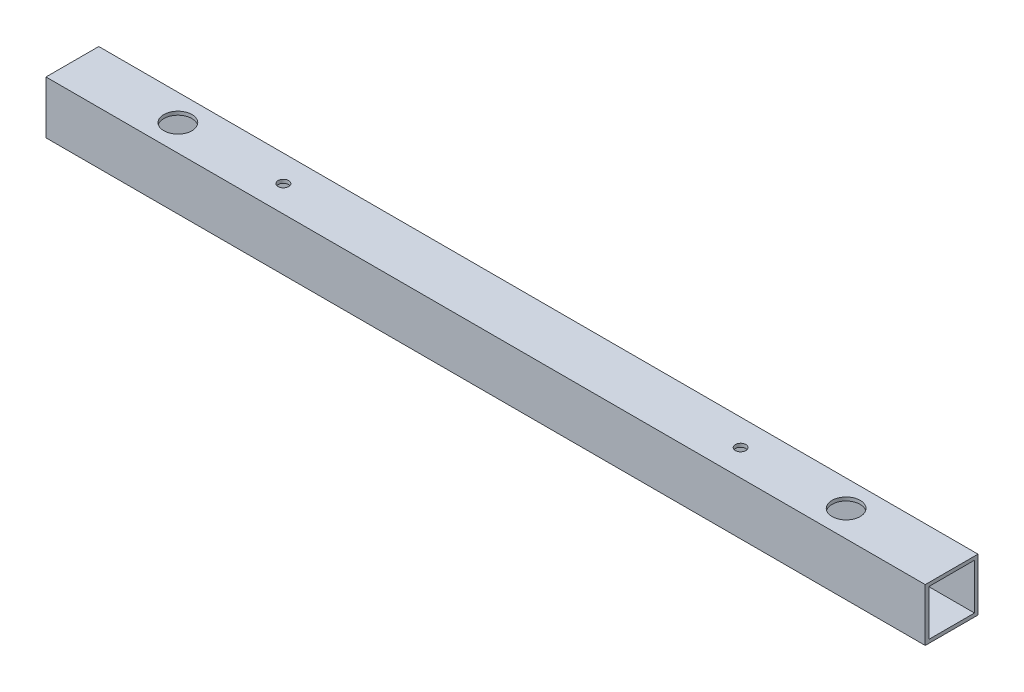
ISO-10303-21;
HEADER;
FILE_DESCRIPTION(('STEP AP214'),'2;1');
FILE_NAME('part.step','',(''),(''),'','','');
FILE_SCHEMA(('AUTOMOTIVE_DESIGN { 1 0 10303 214 1 1 1 1 }'));
ENDSEC;
DATA;
#1=APPLICATION_CONTEXT('core data for automotive mechanical design processes');
#2=APPLICATION_PROTOCOL_DEFINITION('international standard','automotive_design',2000,#1);
#3=PRODUCT_CONTEXT('',#1,'mechanical');
#4=PRODUCT('Part','Part','',(#3));
#5=PRODUCT_RELATED_PRODUCT_CATEGORY('part','',(#4));
#6=PRODUCT_DEFINITION_FORMATION('','',#4);
#7=PRODUCT_DEFINITION_CONTEXT('part definition',#1,'design');
#8=PRODUCT_DEFINITION('design','',#6,#7);
#9=PRODUCT_DEFINITION_SHAPE('','',#8);
#10=(LENGTH_UNIT() NAMED_UNIT(*) SI_UNIT(.MILLI.,.METRE.));
#11=(NAMED_UNIT(*) PLANE_ANGLE_UNIT() SI_UNIT($,.RADIAN.));
#12=(NAMED_UNIT(*) SI_UNIT($,.STERADIAN.) SOLID_ANGLE_UNIT());
#13=UNCERTAINTY_MEASURE_WITH_UNIT(LENGTH_MEASURE(1.E-05),#10,'distance_accuracy_value','');
#14=(GEOMETRIC_REPRESENTATION_CONTEXT(3) GLOBAL_UNCERTAINTY_ASSIGNED_CONTEXT((#13)) GLOBAL_UNIT_ASSIGNED_CONTEXT((#10,
#11,#12)) REPRESENTATION_CONTEXT('',''));
#15=CARTESIAN_POINT('',(0.,0.,0.));
#16=DIRECTION('',(0.,0.,1.));
#17=DIRECTION('',(1.,0.,0.));
#18=AXIS2_PLACEMENT_3D('',#15,#16,#17);
#19=CARTESIAN_POINT('',(250.,0.,0.));
#20=DIRECTION('',(-1.,0.,0.));
#21=DIRECTION('',(0.,0.,1.));
#22=AXIS2_PLACEMENT_3D('',#19,#20,#21);
#23=PLANE('',#22);
#24=DIRECTION('',(0.,1.,0.));
#25=VECTOR('',#24,1.);
#26=CARTESIAN_POINT('',(250.,-7.5,-7.5));
#27=LINE('',#26,#25);
#28=CARTESIAN_POINT('',(250.,-7.5,-7.5));
#29=VERTEX_POINT('',#28);
#30=CARTESIAN_POINT('',(250.,7.5,-7.5));
#31=VERTEX_POINT('',#30);
#32=EDGE_CURVE('E139',#29,#31,#27,.T.);
#33=ORIENTED_EDGE('',*,*,#32,.T.);
#34=DIRECTION('',(0.,0.,1.));
#35=VECTOR('',#34,1.);
#36=CARTESIAN_POINT('',(250.,7.5,7.5));
#37=LINE('',#36,#35);
#38=CARTESIAN_POINT('',(250.,7.5,7.5));
#39=VERTEX_POINT('',#38);
#40=EDGE_CURVE('E142',#31,#39,#37,.T.);
#41=ORIENTED_EDGE('',*,*,#40,.T.);
#42=DIRECTION('',(0.,-1.,0.));
#43=VECTOR('',#42,1.);
#44=CARTESIAN_POINT('',(250.,-7.5,7.5));
#45=LINE('',#44,#43);
#46=CARTESIAN_POINT('',(250.,-7.5,7.5));
#47=VERTEX_POINT('',#46);
#48=EDGE_CURVE('E145',#39,#47,#45,.T.);
#49=ORIENTED_EDGE('',*,*,#48,.T.);
#50=DIRECTION('',(0.,0.,-1.));
#51=VECTOR('',#50,1.);
#52=CARTESIAN_POINT('',(250.,-7.5,7.5));
#53=LINE('',#52,#51);
#54=EDGE_CURVE('E147',#47,#29,#53,.T.);
#55=ORIENTED_EDGE('',*,*,#54,.T.);
#56=EDGE_LOOP('',(#33,#41,#49,#55));
#57=FACE_BOUND('',#56,.T.);
#58=DIRECTION('',(0.,-1.,0.));
#59=VECTOR('',#58,1.);
#60=CARTESIAN_POINT('',(250.,-6.5,6.5));
#61=LINE('',#60,#59);
#62=CARTESIAN_POINT('',(250.,6.5,6.5));
#63=VERTEX_POINT('',#62);
#64=CARTESIAN_POINT('',(250.,-6.5,6.5));
#65=VERTEX_POINT('',#64);
#66=EDGE_CURVE('E101',#63,#65,#61,.T.);
#67=ORIENTED_EDGE('',*,*,#66,.F.);
#68=DIRECTION('',(0.,0.,1.));
#69=VECTOR('',#68,1.);
#70=CARTESIAN_POINT('',(250.,6.5,6.5));
#71=LINE('',#70,#69);
#72=CARTESIAN_POINT('',(250.,6.5,-6.5));
#73=VERTEX_POINT('',#72);
#74=EDGE_CURVE('E123',#73,#63,#71,.T.);
#75=ORIENTED_EDGE('',*,*,#74,.F.);
#76=DIRECTION('',(0.,1.,0.));
#77=VECTOR('',#76,1.);
#78=CARTESIAN_POINT('',(250.,-6.5,-6.5));
#79=LINE('',#78,#77);
#80=CARTESIAN_POINT('',(250.,-6.5,-6.5));
#81=VERTEX_POINT('',#80);
#82=EDGE_CURVE('E121',#81,#73,#79,.T.);
#83=ORIENTED_EDGE('',*,*,#82,.F.);
#84=DIRECTION('',(0.,0.,-1.));
#85=VECTOR('',#84,1.);
#86=CARTESIAN_POINT('',(250.,-6.5,6.5));
#87=LINE('',#86,#85);
#88=EDGE_CURVE('E109',#65,#81,#87,.T.);
#89=ORIENTED_EDGE('',*,*,#88,.F.);
#90=EDGE_LOOP('',(#67,#75,#83,#89));
#91=FACE_BOUND('',#90,.T.);
#92=ADVANCED_FACE('F34',(#57,#91),#23,.F.);
#93=CARTESIAN_POINT('',(0.,0.,0.));
#94=DIRECTION('',(-1.,0.,0.));
#95=DIRECTION('',(0.,0.,1.));
#96=AXIS2_PLACEMENT_3D('',#93,#94,#95);
#97=PLANE('',#96);
#98=DIRECTION('',(0.,1.,0.));
#99=VECTOR('',#98,1.);
#100=CARTESIAN_POINT('',(0.,-7.5,-7.5));
#101=LINE('',#100,#99);
#102=CARTESIAN_POINT('',(0.,-7.5,-7.5));
#103=VERTEX_POINT('',#102);
#104=CARTESIAN_POINT('',(0.,7.5,-7.5));
#105=VERTEX_POINT('',#104);
#106=EDGE_CURVE('E117',#103,#105,#101,.T.);
#107=ORIENTED_EDGE('',*,*,#106,.F.);
#108=DIRECTION('',(0.,0.,-1.));
#109=VECTOR('',#108,1.);
#110=CARTESIAN_POINT('',(0.,-7.5,7.5));
#111=LINE('',#110,#109);
#112=CARTESIAN_POINT('',(0.,-7.5,7.5));
#113=VERTEX_POINT('',#112);
#114=EDGE_CURVE('E143',#113,#103,#111,.T.);
#115=ORIENTED_EDGE('',*,*,#114,.F.);
#116=DIRECTION('',(0.,-1.,0.));
#117=VECTOR('',#116,1.);
#118=CARTESIAN_POINT('',(0.,-7.5,7.5));
#119=LINE('',#118,#117);
#120=CARTESIAN_POINT('',(0.,7.5,7.5));
#121=VERTEX_POINT('',#120);
#122=EDGE_CURVE('E154',#121,#113,#119,.T.);
#123=ORIENTED_EDGE('',*,*,#122,.F.);
#124=DIRECTION('',(0.,0.,1.));
#125=VECTOR('',#124,1.);
#126=CARTESIAN_POINT('',(0.,7.5,7.5));
#127=LINE('',#126,#125);
#128=EDGE_CURVE('E152',#105,#121,#127,.T.);
#129=ORIENTED_EDGE('',*,*,#128,.F.);
#130=EDGE_LOOP('',(#107,#115,#123,#129));
#131=FACE_BOUND('',#130,.T.);
#132=DIRECTION('',(0.,0.,1.));
#133=VECTOR('',#132,1.);
#134=CARTESIAN_POINT('',(0.,6.5,6.5));
#135=LINE('',#134,#133);
#136=CARTESIAN_POINT('',(0.,6.5,-6.5));
#137=VERTEX_POINT('',#136);
#138=CARTESIAN_POINT('',(0.,6.5,6.5));
#139=VERTEX_POINT('',#138);
#140=EDGE_CURVE('E110',#137,#139,#135,.T.);
#141=ORIENTED_EDGE('',*,*,#140,.T.);
#142=DIRECTION('',(0.,-1.,0.));
#143=VECTOR('',#142,1.);
#144=CARTESIAN_POINT('',(0.,-6.5,6.5));
#145=LINE('',#144,#143);
#146=CARTESIAN_POINT('',(0.,-6.5,6.5));
#147=VERTEX_POINT('',#146);
#148=EDGE_CURVE('E59',#139,#147,#145,.T.);
#149=ORIENTED_EDGE('',*,*,#148,.T.);
#150=DIRECTION('',(0.,0.,-1.));
#151=VECTOR('',#150,1.);
#152=CARTESIAN_POINT('',(0.,-6.5,6.5));
#153=LINE('',#152,#151);
#154=CARTESIAN_POINT('',(0.,-6.5,-6.5));
#155=VERTEX_POINT('',#154);
#156=EDGE_CURVE('E116',#147,#155,#153,.T.);
#157=ORIENTED_EDGE('',*,*,#156,.T.);
#158=DIRECTION('',(0.,1.,0.));
#159=VECTOR('',#158,1.);
#160=CARTESIAN_POINT('',(0.,-6.5,-6.5));
#161=LINE('',#160,#159);
#162=EDGE_CURVE('E131',#155,#137,#161,.T.);
#163=ORIENTED_EDGE('',*,*,#162,.T.);
#164=EDGE_LOOP('',(#141,#149,#157,#163));
#165=FACE_BOUND('',#164,.T.);
#166=ADVANCED_FACE('F232',(#131,#165),#97,.T.);
#167=CARTESIAN_POINT('',(250.,-7.5,-7.5));
#168=DIRECTION('',(0.,0.,1.));
#169=DIRECTION('',(1.,0.,0.));
#170=AXIS2_PLACEMENT_3D('',#167,#168,#169);
#171=PLANE('',#170);
#172=ORIENTED_EDGE('',*,*,#106,.T.);
#173=DIRECTION('',(-1.,0.,0.));
#174=VECTOR('',#173,1.);
#175=CARTESIAN_POINT('',(250.,7.5,-7.5));
#176=LINE('',#175,#174);
#177=EDGE_CURVE('E11',#31,#105,#176,.T.);
#178=ORIENTED_EDGE('',*,*,#177,.F.);
#179=ORIENTED_EDGE('',*,*,#32,.F.);
#180=DIRECTION('',(-1.,0.,0.));
#181=VECTOR('',#180,1.);
#182=CARTESIAN_POINT('',(250.,-7.5,-7.5));
#183=LINE('',#182,#181);
#184=EDGE_CURVE('E149',#29,#103,#183,.T.);
#185=ORIENTED_EDGE('',*,*,#184,.T.);
#186=EDGE_LOOP('',(#172,#178,#179,#185));
#187=FACE_BOUND('',#186,.T.);
#188=ADVANCED_FACE('F36',(#187),#171,.F.);
#189=CARTESIAN_POINT('',(250.,7.5,7.5));
#190=DIRECTION('',(0.,-1.,0.));
#191=DIRECTION('',(0.,0.,-1.));
#192=AXIS2_PLACEMENT_3D('',#189,#190,#191);
#193=PLANE('',#192);
#194=CARTESIAN_POINT('',(220.,7.5,0.));
#195=DIRECTION('',(0.,1.,0.));
#196=DIRECTION('',(0.,0.,1.));
#197=AXIS2_PLACEMENT_3D('',#194,#195,#196);
#198=CIRCLE('',#197,3.99999999999999);
#199=CARTESIAN_POINT('',(220.,7.5,3.99999999999999));
#200=VERTEX_POINT('',#199);
#201=EDGE_CURVE('E179',#200,#200,#198,.T.);
#202=ORIENTED_EDGE('',*,*,#201,.F.);
#203=EDGE_LOOP('',(#202));
#204=FACE_BOUND('',#203,.T.);
#205=CARTESIAN_POINT('',(30.,7.5,0.));
#206=DIRECTION('',(0.,1.,0.));
#207=DIRECTION('',(0.,0.,1.));
#208=AXIS2_PLACEMENT_3D('',#205,#206,#207);
#209=CIRCLE('',#208,4.00000000000001);
#210=CARTESIAN_POINT('',(30.,7.5,4.00000000000001));
#211=VERTEX_POINT('',#210);
#212=EDGE_CURVE('E176',#211,#211,#209,.T.);
#213=ORIENTED_EDGE('',*,*,#212,.F.);
#214=EDGE_LOOP('',(#213));
#215=FACE_BOUND('',#214,.T.);
#216=CARTESIAN_POINT('',(60.,7.5,0.));
#217=DIRECTION('',(0.,1.,0.));
#218=DIRECTION('',(0.,0.,1.));
#219=AXIS2_PLACEMENT_3D('',#216,#217,#218);
#220=CIRCLE('',#219,1.5);
#221=CARTESIAN_POINT('',(60.,7.5,1.5));
#222=VERTEX_POINT('',#221);
#223=EDGE_CURVE('E197',#222,#222,#220,.T.);
#224=ORIENTED_EDGE('',*,*,#223,.F.);
#225=EDGE_LOOP('',(#224));
#226=FACE_BOUND('',#225,.T.);
#227=CARTESIAN_POINT('',(190.,7.5,0.));
#228=DIRECTION('',(0.,1.,0.));
#229=DIRECTION('',(0.,0.,-1.));
#230=AXIS2_PLACEMENT_3D('',#227,#228,#229);
#231=CIRCLE('',#230,1.5);
#232=CARTESIAN_POINT('',(190.,7.5,-1.5));
#233=VERTEX_POINT('',#232);
#234=EDGE_CURVE('E175',#233,#233,#231,.T.);
#235=ORIENTED_EDGE('',*,*,#234,.F.);
#236=EDGE_LOOP('',(#235));
#237=FACE_BOUND('',#236,.T.);
#238=ORIENTED_EDGE('',*,*,#128,.T.);
#239=DIRECTION('',(-1.,0.,0.));
#240=VECTOR('',#239,1.);
#241=CARTESIAN_POINT('',(250.,7.5,7.5));
#242=LINE('',#241,#240);
#243=EDGE_CURVE('E43',#39,#121,#242,.T.);
#244=ORIENTED_EDGE('',*,*,#243,.F.);
#245=ORIENTED_EDGE('',*,*,#40,.F.);
#246=ORIENTED_EDGE('',*,*,#177,.T.);
#247=EDGE_LOOP('',(#238,#244,#245,#246));
#248=FACE_BOUND('',#247,.T.);
#249=ADVANCED_FACE('F248',(#204,#215,#226,#237,#248),#193,.F.);
#250=CARTESIAN_POINT('',(250.,-7.5,7.5));
#251=DIRECTION('',(0.,0.,-1.));
#252=DIRECTION('',(-1.,0.,0.));
#253=AXIS2_PLACEMENT_3D('',#250,#251,#252);
#254=PLANE('',#253);
#255=ORIENTED_EDGE('',*,*,#122,.T.);
#256=DIRECTION('',(-1.,0.,0.));
#257=VECTOR('',#256,1.);
#258=CARTESIAN_POINT('',(250.,-7.5,7.5));
#259=LINE('',#258,#257);
#260=EDGE_CURVE('E159',#47,#113,#259,.T.);
#261=ORIENTED_EDGE('',*,*,#260,.F.);
#262=ORIENTED_EDGE('',*,*,#48,.F.);
#263=ORIENTED_EDGE('',*,*,#243,.T.);
#264=EDGE_LOOP('',(#255,#261,#262,#263));
#265=FACE_BOUND('',#264,.T.);
#266=ADVANCED_FACE('F245',(#265),#254,.F.);
#267=CARTESIAN_POINT('',(250.,-7.5,7.5));
#268=DIRECTION('',(0.,1.,0.));
#269=DIRECTION('',(0.,0.,1.));
#270=AXIS2_PLACEMENT_3D('',#267,#268,#269);
#271=PLANE('',#270);
#272=CARTESIAN_POINT('',(190.,-7.5,0.));
#273=DIRECTION('',(0.,-1.,0.));
#274=DIRECTION('',(0.,0.,-1.));
#275=AXIS2_PLACEMENT_3D('',#272,#273,#274);
#276=CIRCLE('',#275,3.99999999999999);
#277=CARTESIAN_POINT('',(190.,-7.5,-3.99999999999999));
#278=VERTEX_POINT('',#277);
#279=EDGE_CURVE('E192',#278,#278,#276,.T.);
#280=ORIENTED_EDGE('',*,*,#279,.F.);
#281=EDGE_LOOP('',(#280));
#282=FACE_BOUND('',#281,.T.);
#283=CARTESIAN_POINT('',(60.,-7.5,0.));
#284=DIRECTION('',(0.,-1.,0.));
#285=DIRECTION('',(0.,0.,-1.));
#286=AXIS2_PLACEMENT_3D('',#283,#284,#285);
#287=CIRCLE('',#286,4.00000000000001);
#288=CARTESIAN_POINT('',(60.,-7.5,-4.00000000000001));
#289=VERTEX_POINT('',#288);
#290=EDGE_CURVE('E182',#289,#289,#287,.T.);
#291=ORIENTED_EDGE('',*,*,#290,.F.);
#292=EDGE_LOOP('',(#291));
#293=FACE_BOUND('',#292,.T.);
#294=CARTESIAN_POINT('',(220.,-7.50000000000001,0.));
#295=DIRECTION('',(0.,1.,0.));
#296=DIRECTION('',(0.,0.,1.));
#297=AXIS2_PLACEMENT_3D('',#294,#295,#296);
#298=CIRCLE('',#297,1.5);
#299=CARTESIAN_POINT('',(220.,-7.50000000000001,1.5));
#300=VERTEX_POINT('',#299);
#301=EDGE_CURVE('E168',#300,#300,#298,.T.);
#302=ORIENTED_EDGE('',*,*,#301,.T.);
#303=EDGE_LOOP('',(#302));
#304=FACE_BOUND('',#303,.T.);
#305=CARTESIAN_POINT('',(30.,-7.50000000000001,0.));
#306=DIRECTION('',(0.,1.,0.));
#307=DIRECTION('',(0.,0.,1.));
#308=AXIS2_PLACEMENT_3D('',#305,#306,#307);
#309=CIRCLE('',#308,1.5);
#310=CARTESIAN_POINT('',(30.,-7.50000000000001,1.5));
#311=VERTEX_POINT('',#310);
#312=EDGE_CURVE('E129',#311,#311,#309,.T.);
#313=ORIENTED_EDGE('',*,*,#312,.T.);
#314=EDGE_LOOP('',(#313));
#315=FACE_BOUND('',#314,.T.);
#316=ORIENTED_EDGE('',*,*,#114,.T.);
#317=ORIENTED_EDGE('',*,*,#184,.F.);
#318=ORIENTED_EDGE('',*,*,#54,.F.);
#319=ORIENTED_EDGE('',*,*,#260,.T.);
#320=EDGE_LOOP('',(#316,#317,#318,#319));
#321=FACE_BOUND('',#320,.T.);
#322=ADVANCED_FACE('F211',(#282,#293,#304,#315,#321),#271,.F.);
#323=CARTESIAN_POINT('',(250.,-6.5,6.5));
#324=DIRECTION('',(0.,0.,-1.));
#325=DIRECTION('',(-1.,0.,0.));
#326=AXIS2_PLACEMENT_3D('',#323,#324,#325);
#327=PLANE('',#326);
#328=ORIENTED_EDGE('',*,*,#148,.F.);
#329=DIRECTION('',(-1.,0.,0.));
#330=VECTOR('',#329,1.);
#331=CARTESIAN_POINT('',(250.,6.5,6.5));
#332=LINE('',#331,#330);
#333=EDGE_CURVE('E105',#63,#139,#332,.T.);
#334=ORIENTED_EDGE('',*,*,#333,.F.);
#335=ORIENTED_EDGE('',*,*,#66,.T.);
#336=DIRECTION('',(-1.,0.,0.));
#337=VECTOR('',#336,1.);
#338=CARTESIAN_POINT('',(250.,-6.5,6.5));
#339=LINE('',#338,#337);
#340=EDGE_CURVE('E104',#65,#147,#339,.T.);
#341=ORIENTED_EDGE('',*,*,#340,.T.);
#342=EDGE_LOOP('',(#328,#334,#335,#341));
#343=FACE_BOUND('',#342,.T.);
#344=ADVANCED_FACE('F103',(#343),#327,.T.);
#345=CARTESIAN_POINT('',(250.,-6.5,6.5));
#346=DIRECTION('',(0.,1.,0.));
#347=DIRECTION('',(0.,0.,1.));
#348=AXIS2_PLACEMENT_3D('',#345,#346,#347);
#349=PLANE('',#348);
#350=CARTESIAN_POINT('',(190.,-6.5,0.));
#351=DIRECTION('',(0.,1.,0.));
#352=DIRECTION('',(0.,0.,1.));
#353=AXIS2_PLACEMENT_3D('',#350,#351,#352);
#354=CIRCLE('',#353,3.99999999999999);
#355=CARTESIAN_POINT('',(190.,-6.5,3.99999999999999));
#356=VERTEX_POINT('',#355);
#357=EDGE_CURVE('E38',#356,#356,#354,.T.);
#358=ORIENTED_EDGE('',*,*,#357,.F.);
#359=EDGE_LOOP('',(#358));
#360=FACE_BOUND('',#359,.T.);
#361=CARTESIAN_POINT('',(60.,-6.5,0.));
#362=DIRECTION('',(0.,1.,0.));
#363=DIRECTION('',(0.,0.,1.));
#364=AXIS2_PLACEMENT_3D('',#361,#362,#363);
#365=CIRCLE('',#364,4.00000000000001);
#366=CARTESIAN_POINT('',(60.,-6.5,4.00000000000001));
#367=VERTEX_POINT('',#366);
#368=EDGE_CURVE('E180',#367,#367,#365,.T.);
#369=ORIENTED_EDGE('',*,*,#368,.F.);
#370=EDGE_LOOP('',(#369));
#371=FACE_BOUND('',#370,.T.);
#372=CARTESIAN_POINT('',(220.,-6.50000000000001,0.));
#373=DIRECTION('',(0.,1.,0.));
#374=DIRECTION('',(0.,0.,1.));
#375=AXIS2_PLACEMENT_3D('',#372,#373,#374);
#376=CIRCLE('',#375,1.5);
#377=CARTESIAN_POINT('',(220.,-6.50000000000001,1.5));
#378=VERTEX_POINT('',#377);
#379=EDGE_CURVE('E200',#378,#378,#376,.T.);
#380=ORIENTED_EDGE('',*,*,#379,.F.);
#381=EDGE_LOOP('',(#380));
#382=FACE_BOUND('',#381,.T.);
#383=CARTESIAN_POINT('',(30.,-6.50000000000001,0.));
#384=DIRECTION('',(0.,1.,0.));
#385=DIRECTION('',(0.,0.,1.));
#386=AXIS2_PLACEMENT_3D('',#383,#384,#385);
#387=CIRCLE('',#386,1.5);
#388=CARTESIAN_POINT('',(30.,-6.50000000000001,1.5));
#389=VERTEX_POINT('',#388);
#390=EDGE_CURVE('E171',#389,#389,#387,.T.);
#391=ORIENTED_EDGE('',*,*,#390,.F.);
#392=EDGE_LOOP('',(#391));
#393=FACE_BOUND('',#392,.T.);
#394=ORIENTED_EDGE('',*,*,#156,.F.);
#395=ORIENTED_EDGE('',*,*,#340,.F.);
#396=ORIENTED_EDGE('',*,*,#88,.T.);
#397=DIRECTION('',(-1.,0.,0.));
#398=VECTOR('',#397,1.);
#399=CARTESIAN_POINT('',(250.,-6.5,-6.5));
#400=LINE('',#399,#398);
#401=EDGE_CURVE('E118',#81,#155,#400,.T.);
#402=ORIENTED_EDGE('',*,*,#401,.T.);
#403=EDGE_LOOP('',(#394,#395,#396,#402));
#404=FACE_BOUND('',#403,.T.);
#405=ADVANCED_FACE('F113',(#360,#371,#382,#393,#404),#349,.T.);
#406=CARTESIAN_POINT('',(250.,-6.5,-6.5));
#407=DIRECTION('',(0.,0.,1.));
#408=DIRECTION('',(0.,-1.,0.));
#409=AXIS2_PLACEMENT_3D('',#406,#407,#408);
#410=PLANE('',#409);
#411=ORIENTED_EDGE('',*,*,#162,.F.);
#412=ORIENTED_EDGE('',*,*,#401,.F.);
#413=ORIENTED_EDGE('',*,*,#82,.T.);
#414=DIRECTION('',(-1.,0.,0.));
#415=VECTOR('',#414,1.);
#416=CARTESIAN_POINT('',(250.,6.5,-6.5));
#417=LINE('',#416,#415);
#418=EDGE_CURVE('E51',#73,#137,#417,.T.);
#419=ORIENTED_EDGE('',*,*,#418,.T.);
#420=EDGE_LOOP('',(#411,#412,#413,#419));
#421=FACE_BOUND('',#420,.T.);
#422=ADVANCED_FACE('F227',(#421),#410,.T.);
#423=CARTESIAN_POINT('',(250.,6.5,6.5));
#424=DIRECTION('',(0.,-1.,0.));
#425=DIRECTION('',(0.,0.,-1.));
#426=AXIS2_PLACEMENT_3D('',#423,#424,#425);
#427=PLANE('',#426);
#428=CARTESIAN_POINT('',(220.,6.5,0.));
#429=DIRECTION('',(0.,-1.,0.));
#430=DIRECTION('',(0.,0.,-1.));
#431=AXIS2_PLACEMENT_3D('',#428,#429,#430);
#432=CIRCLE('',#431,3.99999999999999);
#433=CARTESIAN_POINT('',(220.,6.5,-3.99999999999999));
#434=VERTEX_POINT('',#433);
#435=EDGE_CURVE('E177',#434,#434,#432,.T.);
#436=ORIENTED_EDGE('',*,*,#435,.F.);
#437=EDGE_LOOP('',(#436));
#438=FACE_BOUND('',#437,.T.);
#439=CARTESIAN_POINT('',(30.,6.5,0.));
#440=DIRECTION('',(0.,-1.,0.));
#441=DIRECTION('',(0.,0.,-1.));
#442=AXIS2_PLACEMENT_3D('',#439,#440,#441);
#443=CIRCLE('',#442,4.00000000000001);
#444=CARTESIAN_POINT('',(30.,6.5,-4.00000000000001));
#445=VERTEX_POINT('',#444);
#446=EDGE_CURVE('E172',#445,#445,#443,.T.);
#447=ORIENTED_EDGE('',*,*,#446,.F.);
#448=EDGE_LOOP('',(#447));
#449=FACE_BOUND('',#448,.T.);
#450=CARTESIAN_POINT('',(60.,6.50000000000001,0.));
#451=DIRECTION('',(0.,-1.,0.));
#452=DIRECTION('',(0.,0.,-1.));
#453=AXIS2_PLACEMENT_3D('',#450,#451,#452);
#454=CIRCLE('',#453,1.5);
#455=CARTESIAN_POINT('',(60.,6.50000000000001,-1.5));
#456=VERTEX_POINT('',#455);
#457=EDGE_CURVE('E167',#456,#456,#454,.T.);
#458=ORIENTED_EDGE('',*,*,#457,.F.);
#459=EDGE_LOOP('',(#458));
#460=FACE_BOUND('',#459,.T.);
#461=CARTESIAN_POINT('',(190.,6.50000000000001,0.));
#462=DIRECTION('',(0.,-1.,0.));
#463=DIRECTION('',(0.,0.,-1.));
#464=AXIS2_PLACEMENT_3D('',#461,#462,#463);
#465=CIRCLE('',#464,1.5);
#466=CARTESIAN_POINT('',(190.,6.50000000000001,-1.5));
#467=VERTEX_POINT('',#466);
#468=EDGE_CURVE('E164',#467,#467,#465,.T.);
#469=ORIENTED_EDGE('',*,*,#468,.F.);
#470=EDGE_LOOP('',(#469));
#471=FACE_BOUND('',#470,.T.);
#472=ORIENTED_EDGE('',*,*,#140,.F.);
#473=ORIENTED_EDGE('',*,*,#418,.F.);
#474=ORIENTED_EDGE('',*,*,#74,.T.);
#475=ORIENTED_EDGE('',*,*,#333,.T.);
#476=EDGE_LOOP('',(#472,#473,#474,#475));
#477=FACE_BOUND('',#476,.T.);
#478=ADVANCED_FACE('F217',(#438,#449,#460,#471,#477),#427,.T.);
#479=CARTESIAN_POINT('',(30.,-242.5,0.));
#480=DIRECTION('',(0.,1.,0.));
#481=DIRECTION('',(0.,0.,1.));
#482=AXIS2_PLACEMENT_3D('',#479,#480,#481);
#483=CYLINDRICAL_SURFACE('',#482,1.5);
#484=ORIENTED_EDGE('',*,*,#390,.T.);
#485=EDGE_LOOP('',(#484));
#486=FACE_BOUND('',#485,.T.);
#487=ORIENTED_EDGE('',*,*,#312,.F.);
#488=EDGE_LOOP('',(#487));
#489=FACE_BOUND('',#488,.T.);
#490=ADVANCED_FACE('F214',(#486,#489),#483,.F.);
#491=CARTESIAN_POINT('',(190.,-242.5,0.));
#492=DIRECTION('',(0.,1.,0.));
#493=DIRECTION('',(0.,0.,1.));
#494=AXIS2_PLACEMENT_3D('',#491,#492,#493);
#495=CYLINDRICAL_SURFACE('',#494,1.5);
#496=ORIENTED_EDGE('',*,*,#468,.T.);
#497=EDGE_LOOP('',(#496));
#498=FACE_BOUND('',#497,.T.);
#499=ORIENTED_EDGE('',*,*,#234,.T.);
#500=EDGE_LOOP('',(#499));
#501=FACE_BOUND('',#500,.T.);
#502=ADVANCED_FACE('F216',(#498,#501),#495,.F.);
#503=CARTESIAN_POINT('',(60.,-242.5,0.));
#504=DIRECTION('',(0.,1.,0.));
#505=DIRECTION('',(0.,0.,1.));
#506=AXIS2_PLACEMENT_3D('',#503,#504,#505);
#507=CYLINDRICAL_SURFACE('',#506,1.5);
#508=ORIENTED_EDGE('',*,*,#457,.T.);
#509=EDGE_LOOP('',(#508));
#510=FACE_BOUND('',#509,.T.);
#511=ORIENTED_EDGE('',*,*,#223,.T.);
#512=EDGE_LOOP('',(#511));
#513=FACE_BOUND('',#512,.T.);
#514=ADVANCED_FACE('F224',(#510,#513),#507,.F.);
#515=CARTESIAN_POINT('',(220.,-242.5,0.));
#516=DIRECTION('',(0.,1.,0.));
#517=DIRECTION('',(0.,0.,1.));
#518=AXIS2_PLACEMENT_3D('',#515,#516,#517);
#519=CYLINDRICAL_SURFACE('',#518,1.5);
#520=ORIENTED_EDGE('',*,*,#379,.T.);
#521=EDGE_LOOP('',(#520));
#522=FACE_BOUND('',#521,.T.);
#523=ORIENTED_EDGE('',*,*,#301,.F.);
#524=EDGE_LOOP('',(#523));
#525=FACE_BOUND('',#524,.T.);
#526=ADVANCED_FACE('F293',(#522,#525),#519,.F.);
#527=CARTESIAN_POINT('',(30.,-2.5,0.));
#528=DIRECTION('',(0.,1.,0.));
#529=DIRECTION('',(0.,0.,1.));
#530=AXIS2_PLACEMENT_3D('',#527,#528,#529);
#531=CYLINDRICAL_SURFACE('',#530,4.00000000000001);
#532=ORIENTED_EDGE('',*,*,#446,.T.);
#533=EDGE_LOOP('',(#532));
#534=FACE_BOUND('',#533,.T.);
#535=ORIENTED_EDGE('',*,*,#212,.T.);
#536=EDGE_LOOP('',(#535));
#537=FACE_BOUND('',#536,.T.);
#538=ADVANCED_FACE('F296',(#534,#537),#531,.F.);
#539=CARTESIAN_POINT('',(220.,-2.5,0.));
#540=DIRECTION('',(0.,1.,0.));
#541=DIRECTION('',(0.,0.,1.));
#542=AXIS2_PLACEMENT_3D('',#539,#540,#541);
#543=CYLINDRICAL_SURFACE('',#542,3.99999999999999);
#544=ORIENTED_EDGE('',*,*,#435,.T.);
#545=EDGE_LOOP('',(#544));
#546=FACE_BOUND('',#545,.T.);
#547=ORIENTED_EDGE('',*,*,#201,.T.);
#548=EDGE_LOOP('',(#547));
#549=FACE_BOUND('',#548,.T.);
#550=ADVANCED_FACE('F303',(#546,#549),#543,.F.);
#551=CARTESIAN_POINT('',(60.,2.5,0.));
#552=DIRECTION('',(0.,-1.,0.));
#553=DIRECTION('',(0.,0.,-1.));
#554=AXIS2_PLACEMENT_3D('',#551,#552,#553);
#555=CYLINDRICAL_SURFACE('',#554,4.00000000000001);
#556=ORIENTED_EDGE('',*,*,#368,.T.);
#557=EDGE_LOOP('',(#556));
#558=FACE_BOUND('',#557,.T.);
#559=ORIENTED_EDGE('',*,*,#290,.T.);
#560=EDGE_LOOP('',(#559));
#561=FACE_BOUND('',#560,.T.);
#562=ADVANCED_FACE('F311',(#558,#561),#555,.F.);
#563=CARTESIAN_POINT('',(190.,2.5,0.));
#564=DIRECTION('',(0.,-1.,0.));
#565=DIRECTION('',(0.,0.,-1.));
#566=AXIS2_PLACEMENT_3D('',#563,#564,#565);
#567=CYLINDRICAL_SURFACE('',#566,3.99999999999999);
#568=ORIENTED_EDGE('',*,*,#357,.T.);
#569=EDGE_LOOP('',(#568));
#570=FACE_BOUND('',#569,.T.);
#571=ORIENTED_EDGE('',*,*,#279,.T.);
#572=EDGE_LOOP('',(#571));
#573=FACE_BOUND('',#572,.T.);
#574=ADVANCED_FACE('F315',(#570,#573),#567,.F.);
#575=CLOSED_SHELL('',(#92,#166,#188,#249,#266,#322,#344,#405,#422,#478,#490,#502,#514,#526,#538,
#550,#562,#574));
#576=MANIFOLD_SOLID_BREP('B2',#575);
#577=ADVANCED_BREP_SHAPE_REPRESENTATION('',(#18,#576),#14);
#578=SHAPE_DEFINITION_REPRESENTATION(#9,#577);
ENDSEC;
END-ISO-10303-21;
